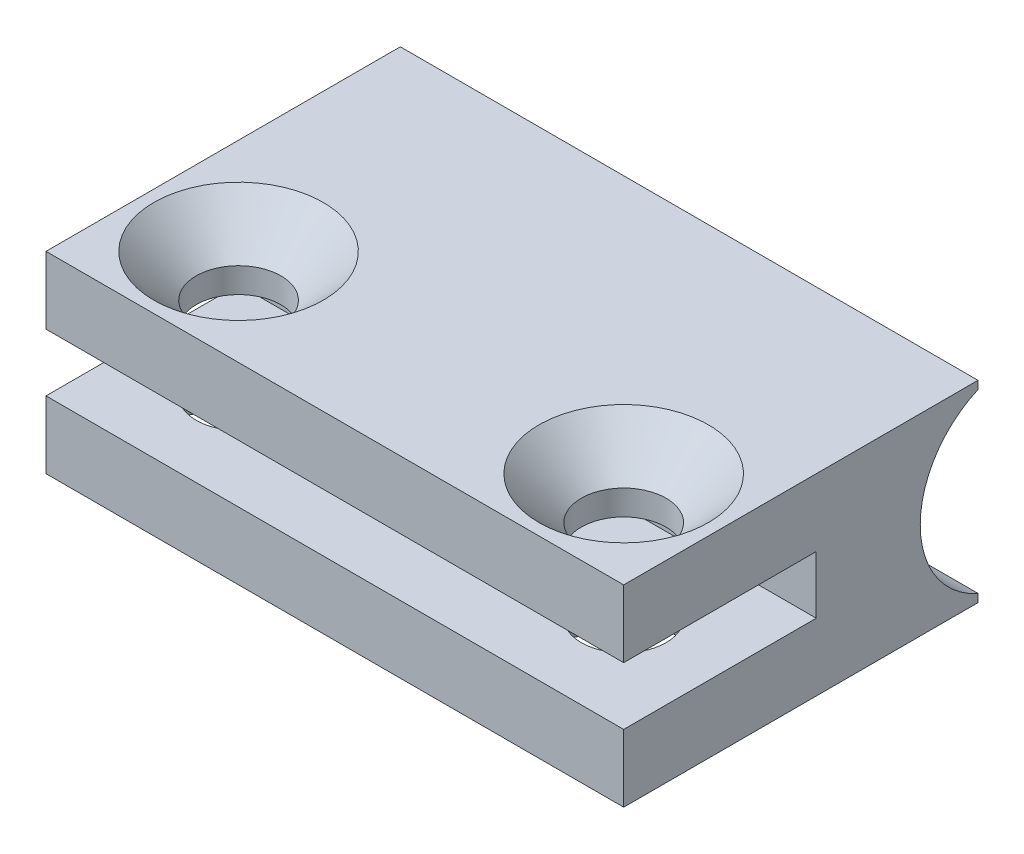
ISO-10303-21;
HEADER;
FILE_DESCRIPTION(('STEP AP214'),'2;1');
FILE_NAME('part.step','',(''),(''),'','','');
FILE_SCHEMA(('AUTOMOTIVE_DESIGN { 1 0 10303 214 1 1 1 1 }'));
ENDSEC;
DATA;
#1=APPLICATION_CONTEXT('core data for automotive mechanical design processes');
#2=APPLICATION_PROTOCOL_DEFINITION('international standard','automotive_design',2000,#1);
#3=PRODUCT_CONTEXT('',#1,'mechanical');
#4=PRODUCT('Part','Part','',(#3));
#5=PRODUCT_RELATED_PRODUCT_CATEGORY('part','',(#4));
#6=PRODUCT_DEFINITION_FORMATION('','',#4);
#7=PRODUCT_DEFINITION_CONTEXT('part definition',#1,'design');
#8=PRODUCT_DEFINITION('design','',#6,#7);
#9=PRODUCT_DEFINITION_SHAPE('','',#8);
#10=(LENGTH_UNIT() NAMED_UNIT(*) SI_UNIT(.MILLI.,.METRE.));
#11=(NAMED_UNIT(*) PLANE_ANGLE_UNIT() SI_UNIT($,.RADIAN.));
#12=(NAMED_UNIT(*) SI_UNIT($,.STERADIAN.) SOLID_ANGLE_UNIT());
#13=UNCERTAINTY_MEASURE_WITH_UNIT(LENGTH_MEASURE(1.E-05),#10,'distance_accuracy_value','');
#14=(GEOMETRIC_REPRESENTATION_CONTEXT(3) GLOBAL_UNCERTAINTY_ASSIGNED_CONTEXT((#13)) GLOBAL_UNIT_ASSIGNED_CONTEXT((#10,
#11,#12)) REPRESENTATION_CONTEXT('',''));
#15=CARTESIAN_POINT('',(0.,0.,0.));
#16=DIRECTION('',(0.,0.,1.));
#17=DIRECTION('',(1.,0.,0.));
#18=AXIS2_PLACEMENT_3D('',#15,#16,#17);
#19=CARTESIAN_POINT('',(2.5,2.5,-2.5));
#20=DIRECTION('',(0.,1.,0.));
#21=DIRECTION('',(0.,0.,1.));
#22=AXIS2_PLACEMENT_3D('',#19,#20,#21);
#23=CYLINDRICAL_SURFACE('',#22,1.1);
#24=CARTESIAN_POINT('',(2.5,-0.75,-2.5));
#25=DIRECTION('',(0.,-1.,0.));
#26=DIRECTION('',(0.,0.,-1.));
#27=AXIS2_PLACEMENT_3D('',#24,#25,#26);
#28=CIRCLE('',#27,1.1);
#29=CARTESIAN_POINT('',(2.5,-0.75,-3.6));
#30=VERTEX_POINT('',#29);
#31=EDGE_CURVE('E308',#30,#30,#28,.T.);
#32=ORIENTED_EDGE('',*,*,#31,.F.);
#33=EDGE_LOOP('',(#32));
#34=FACE_BOUND('',#33,.T.);
#35=CARTESIAN_POINT('',(2.5,-1.3,-2.5));
#36=DIRECTION('',(0.,-1.,0.));
#37=DIRECTION('',(0.,0.,-1.));
#38=AXIS2_PLACEMENT_3D('',#35,#36,#37);
#39=CIRCLE('',#38,1.1);
#40=CARTESIAN_POINT('',(2.5,-1.3,-3.6));
#41=VERTEX_POINT('',#40);
#42=EDGE_CURVE('E280',#41,#41,#39,.F.);
#43=ORIENTED_EDGE('',*,*,#42,.F.);
#44=EDGE_LOOP('',(#43));
#45=FACE_BOUND('',#44,.T.);
#46=ADVANCED_FACE('F37',(#34,#45),#23,.F.);
#47=CARTESIAN_POINT('',(15.,0.,-10.2));
#48=DIRECTION('',(-1.,0.,0.));
#49=DIRECTION('',(0.,0.,1.));
#50=AXIS2_PLACEMENT_3D('',#47,#48,#49);
#51=CYLINDRICAL_SURFACE('',#50,2.5);
#52=DIRECTION('',(-1.,0.,0.));
#53=VECTOR('',#52,1.);
#54=CARTESIAN_POINT('',(15.,-2.29128784747792,-9.2));
#55=LINE('',#54,#53);
#56=CARTESIAN_POINT('',(0.,-2.29128784747792,-9.2));
#57=VERTEX_POINT('',#56);
#58=CARTESIAN_POINT('',(15.,-2.29128784747792,-9.2));
#59=VERTEX_POINT('',#58);
#60=EDGE_CURVE('E317',#57,#59,#55,.F.);
#61=ORIENTED_EDGE('',*,*,#60,.F.);
#62=CARTESIAN_POINT('',(0.,0.,-10.2));
#63=DIRECTION('',(1.,0.,0.));
#64=DIRECTION('',(0.,0.,-1.));
#65=AXIS2_PLACEMENT_3D('',#62,#63,#64);
#66=CIRCLE('',#65,2.5);
#67=CARTESIAN_POINT('',(0.,2.29128784747792,-9.2));
#68=VERTEX_POINT('',#67);
#69=EDGE_CURVE('E328',#68,#57,#66,.T.);
#70=ORIENTED_EDGE('',*,*,#69,.F.);
#71=DIRECTION('',(-1.,0.,0.));
#72=VECTOR('',#71,1.);
#73=CARTESIAN_POINT('',(15.,2.29128784747792,-9.2));
#74=LINE('',#73,#72);
#75=CARTESIAN_POINT('',(15.,2.29128784747792,-9.2));
#76=VERTEX_POINT('',#75);
#77=EDGE_CURVE('E326',#76,#68,#74,.T.);
#78=ORIENTED_EDGE('',*,*,#77,.F.);
#79=CARTESIAN_POINT('',(15.,0.,-10.2));
#80=DIRECTION('',(1.,0.,0.));
#81=DIRECTION('',(0.,0.,-1.));
#82=AXIS2_PLACEMENT_3D('',#79,#80,#81);
#83=CIRCLE('',#82,2.5);
#84=EDGE_CURVE('E329',#76,#59,#83,.T.);
#85=ORIENTED_EDGE('',*,*,#84,.T.);
#86=EDGE_LOOP('',(#61,#70,#78,#85));
#87=FACE_BOUND('',#86,.T.);
#88=ADVANCED_FACE('F39',(#87),#51,.F.);
#89=CARTESIAN_POINT('',(15.,2.5,0.));
#90=DIRECTION('',(0.,1.,0.));
#91=DIRECTION('',(0.,0.,1.));
#92=AXIS2_PLACEMENT_3D('',#89,#90,#91);
#93=PLANE('',#92);
#94=CARTESIAN_POINT('',(12.5,2.5,-2.5));
#95=DIRECTION('',(0.,1.,0.));
#96=DIRECTION('',(0.,0.,1.));
#97=AXIS2_PLACEMENT_3D('',#94,#95,#96);
#98=CIRCLE('',#97,2.2);
#99=CARTESIAN_POINT('',(12.5,2.5,-0.299999999999999));
#100=VERTEX_POINT('',#99);
#101=EDGE_CURVE('E290',#100,#100,#98,.T.);
#102=ORIENTED_EDGE('',*,*,#101,.F.);
#103=EDGE_LOOP('',(#102));
#104=FACE_BOUND('',#103,.T.);
#105=CARTESIAN_POINT('',(2.5,2.5,-2.5));
#106=DIRECTION('',(0.,1.,0.));
#107=DIRECTION('',(0.,0.,1.));
#108=AXIS2_PLACEMENT_3D('',#105,#106,#107);
#109=CIRCLE('',#108,2.2);
#110=CARTESIAN_POINT('',(2.5,2.5,-0.299999999999999));
#111=VERTEX_POINT('',#110);
#112=EDGE_CURVE('E302',#111,#111,#109,.T.);
#113=ORIENTED_EDGE('',*,*,#112,.F.);
#114=EDGE_LOOP('',(#113));
#115=FACE_BOUND('',#114,.T.);
#116=DIRECTION('',(1.,0.,0.));
#117=VECTOR('',#116,1.);
#118=CARTESIAN_POINT('',(0.,2.5,-9.2));
#119=LINE('',#118,#117);
#120=CARTESIAN_POINT('',(0.,2.5,-9.2));
#121=VERTEX_POINT('',#120);
#122=CARTESIAN_POINT('',(15.,2.5,-9.2));
#123=VERTEX_POINT('',#122);
#124=EDGE_CURVE('E323',#121,#123,#119,.T.);
#125=ORIENTED_EDGE('',*,*,#124,.F.);
#126=DIRECTION('',(0.,0.,-1.));
#127=VECTOR('',#126,1.);
#128=CARTESIAN_POINT('',(0.,2.5,0.));
#129=LINE('',#128,#127);
#130=CARTESIAN_POINT('',(0.,2.5,0.));
#131=VERTEX_POINT('',#130);
#132=EDGE_CURVE('E352',#131,#121,#129,.T.);
#133=ORIENTED_EDGE('',*,*,#132,.F.);
#134=DIRECTION('',(-1.,0.,0.));
#135=VECTOR('',#134,1.);
#136=CARTESIAN_POINT('',(15.,2.5,0.));
#137=LINE('',#136,#135);
#138=CARTESIAN_POINT('',(15.,2.5,0.));
#139=VERTEX_POINT('',#138);
#140=EDGE_CURVE('E46',#139,#131,#137,.T.);
#141=ORIENTED_EDGE('',*,*,#140,.F.);
#142=DIRECTION('',(0.,0.,-1.));
#143=VECTOR('',#142,1.);
#144=CARTESIAN_POINT('',(15.,2.5,0.));
#145=LINE('',#144,#143);
#146=EDGE_CURVE('E332',#139,#123,#145,.T.);
#147=ORIENTED_EDGE('',*,*,#146,.T.);
#148=EDGE_LOOP('',(#125,#133,#141,#147));
#149=FACE_BOUND('',#148,.T.);
#150=ADVANCED_FACE('F395',(#104,#115,#149),#93,.T.);
#151=CARTESIAN_POINT('',(15.,0.,0.));
#152=DIRECTION('',(0.,0.,-1.));
#153=DIRECTION('',(0.,1.,0.));
#154=AXIS2_PLACEMENT_3D('',#151,#152,#153);
#155=PLANE('',#154);
#156=DIRECTION('',(0.,-1.,0.));
#157=VECTOR('',#156,1.);
#158=CARTESIAN_POINT('',(0.,0.,0.));
#159=LINE('',#158,#157);
#160=CARTESIAN_POINT('',(0.,0.75,0.));
#161=VERTEX_POINT('',#160);
#162=EDGE_CURVE('E355',#131,#161,#159,.T.);
#163=ORIENTED_EDGE('',*,*,#162,.T.);
#164=DIRECTION('',(-1.,0.,0.));
#165=VECTOR('',#164,1.);
#166=CARTESIAN_POINT('',(15.,0.75,0.));
#167=LINE('',#166,#165);
#168=CARTESIAN_POINT('',(15.,0.75,0.));
#169=VERTEX_POINT('',#168);
#170=EDGE_CURVE('E378',#169,#161,#167,.T.);
#171=ORIENTED_EDGE('',*,*,#170,.F.);
#172=DIRECTION('',(0.,-1.,0.));
#173=VECTOR('',#172,1.);
#174=CARTESIAN_POINT('',(15.,0.,0.));
#175=LINE('',#174,#173);
#176=EDGE_CURVE('E336',#139,#169,#175,.T.);
#177=ORIENTED_EDGE('',*,*,#176,.F.);
#178=ORIENTED_EDGE('',*,*,#140,.T.);
#179=EDGE_LOOP('',(#163,#171,#177,#178));
#180=FACE_BOUND('',#179,.T.);
#181=ADVANCED_FACE('F420',(#180),#155,.F.);
#182=CARTESIAN_POINT('',(15.,0.75,0.));
#183=DIRECTION('',(0.,1.,0.));
#184=DIRECTION('',(0.,0.,1.));
#185=AXIS2_PLACEMENT_3D('',#182,#183,#184);
#186=PLANE('',#185);
#187=CARTESIAN_POINT('',(12.5,0.75,-2.5));
#188=DIRECTION('',(0.,1.,0.));
#189=DIRECTION('',(0.,0.,1.));
#190=AXIS2_PLACEMENT_3D('',#187,#188,#189);
#191=CIRCLE('',#190,1.1);
#192=CARTESIAN_POINT('',(12.5,0.75,-1.4));
#193=VERTEX_POINT('',#192);
#194=EDGE_CURVE('E299',#193,#193,#191,.T.);
#195=ORIENTED_EDGE('',*,*,#194,.T.);
#196=EDGE_LOOP('',(#195));
#197=FACE_BOUND('',#196,.T.);
#198=CARTESIAN_POINT('',(2.5,0.75,-2.5));
#199=DIRECTION('',(0.,1.,0.));
#200=DIRECTION('',(0.,0.,1.));
#201=AXIS2_PLACEMENT_3D('',#198,#199,#200);
#202=CIRCLE('',#201,1.1);
#203=CARTESIAN_POINT('',(2.5,0.75,-1.4));
#204=VERTEX_POINT('',#203);
#205=EDGE_CURVE('E309',#204,#204,#202,.T.);
#206=ORIENTED_EDGE('',*,*,#205,.T.);
#207=EDGE_LOOP('',(#206));
#208=FACE_BOUND('',#207,.T.);
#209=DIRECTION('',(0.,0.,-1.));
#210=VECTOR('',#209,1.);
#211=CARTESIAN_POINT('',(0.,0.75,0.));
#212=LINE('',#211,#210);
#213=CARTESIAN_POINT('',(0.,0.75,-5.));
#214=VERTEX_POINT('',#213);
#215=EDGE_CURVE('E357',#161,#214,#212,.T.);
#216=ORIENTED_EDGE('',*,*,#215,.T.);
#217=DIRECTION('',(-1.,0.,0.));
#218=VECTOR('',#217,1.);
#219=CARTESIAN_POINT('',(15.,0.75,-5.));
#220=LINE('',#219,#218);
#221=CARTESIAN_POINT('',(15.,0.75,-5.));
#222=VERTEX_POINT('',#221);
#223=EDGE_CURVE('E375',#222,#214,#220,.T.);
#224=ORIENTED_EDGE('',*,*,#223,.F.);
#225=DIRECTION('',(0.,0.,-1.));
#226=VECTOR('',#225,1.);
#227=CARTESIAN_POINT('',(15.,0.75,0.));
#228=LINE('',#227,#226);
#229=EDGE_CURVE('E338',#169,#222,#228,.T.);
#230=ORIENTED_EDGE('',*,*,#229,.F.);
#231=ORIENTED_EDGE('',*,*,#170,.T.);
#232=EDGE_LOOP('',(#216,#224,#230,#231));
#233=FACE_BOUND('',#232,.T.);
#234=ADVANCED_FACE('F416',(#197,#208,#233),#186,.F.);
#235=CARTESIAN_POINT('',(15.,0.,-5.));
#236=DIRECTION('',(0.,0.,-1.));
#237=DIRECTION('',(-1.,0.,0.));
#238=AXIS2_PLACEMENT_3D('',#235,#236,#237);
#239=PLANE('',#238);
#240=DIRECTION('',(0.,-1.,0.));
#241=VECTOR('',#240,1.);
#242=CARTESIAN_POINT('',(0.,0.,-5.));
#243=LINE('',#242,#241);
#244=CARTESIAN_POINT('',(0.,-0.749999999999999,-5.));
#245=VERTEX_POINT('',#244);
#246=EDGE_CURVE('E359',#214,#245,#243,.T.);
#247=ORIENTED_EDGE('',*,*,#246,.T.);
#248=DIRECTION('',(-1.,0.,0.));
#249=VECTOR('',#248,1.);
#250=CARTESIAN_POINT('',(15.,-0.749999999999999,-5.));
#251=LINE('',#250,#249);
#252=CARTESIAN_POINT('',(15.,-0.749999999999999,-5.));
#253=VERTEX_POINT('',#252);
#254=EDGE_CURVE('E372',#253,#245,#251,.T.);
#255=ORIENTED_EDGE('',*,*,#254,.F.);
#256=DIRECTION('',(0.,-1.,0.));
#257=VECTOR('',#256,1.);
#258=CARTESIAN_POINT('',(15.,0.,-5.));
#259=LINE('',#258,#257);
#260=EDGE_CURVE('E340',#222,#253,#259,.T.);
#261=ORIENTED_EDGE('',*,*,#260,.F.);
#262=ORIENTED_EDGE('',*,*,#223,.T.);
#263=EDGE_LOOP('',(#247,#255,#261,#262));
#264=FACE_BOUND('',#263,.T.);
#265=ADVANCED_FACE('F419',(#264),#239,.F.);
#266=CARTESIAN_POINT('',(15.,-0.75,0.));
#267=DIRECTION('',(0.,-1.,0.));
#268=DIRECTION('',(0.,0.,-1.));
#269=AXIS2_PLACEMENT_3D('',#266,#267,#268);
#270=PLANE('',#269);
#271=CARTESIAN_POINT('',(12.5,-0.75,-2.5));
#272=DIRECTION('',(0.,-1.,0.));
#273=DIRECTION('',(0.,0.,-1.));
#274=AXIS2_PLACEMENT_3D('',#271,#272,#273);
#275=CIRCLE('',#274,1.1);
#276=CARTESIAN_POINT('',(12.5,-0.75,-3.6));
#277=VERTEX_POINT('',#276);
#278=EDGE_CURVE('E296',#277,#277,#275,.T.);
#279=ORIENTED_EDGE('',*,*,#278,.T.);
#280=EDGE_LOOP('',(#279));
#281=FACE_BOUND('',#280,.T.);
#282=ORIENTED_EDGE('',*,*,#31,.T.);
#283=EDGE_LOOP('',(#282));
#284=FACE_BOUND('',#283,.T.);
#285=DIRECTION('',(0.,0.,1.));
#286=VECTOR('',#285,1.);
#287=CARTESIAN_POINT('',(0.,-0.75,0.));
#288=LINE('',#287,#286);
#289=CARTESIAN_POINT('',(0.,-0.75,0.));
#290=VERTEX_POINT('',#289);
#291=EDGE_CURVE('E361',#245,#290,#288,.T.);
#292=ORIENTED_EDGE('',*,*,#291,.T.);
#293=DIRECTION('',(-1.,0.,0.));
#294=VECTOR('',#293,1.);
#295=CARTESIAN_POINT('',(15.,-0.75,0.));
#296=LINE('',#295,#294);
#297=CARTESIAN_POINT('',(15.,-0.75,0.));
#298=VERTEX_POINT('',#297);
#299=EDGE_CURVE('E369',#298,#290,#296,.T.);
#300=ORIENTED_EDGE('',*,*,#299,.F.);
#301=DIRECTION('',(0.,0.,1.));
#302=VECTOR('',#301,1.);
#303=CARTESIAN_POINT('',(15.,-0.75,0.));
#304=LINE('',#303,#302);
#305=EDGE_CURVE('E342',#253,#298,#304,.T.);
#306=ORIENTED_EDGE('',*,*,#305,.F.);
#307=ORIENTED_EDGE('',*,*,#254,.T.);
#308=EDGE_LOOP('',(#292,#300,#306,#307));
#309=FACE_BOUND('',#308,.T.);
#310=ADVANCED_FACE('F439',(#281,#284,#309),#270,.F.);
#311=CARTESIAN_POINT('',(15.,0.,0.));
#312=DIRECTION('',(0.,0.,-1.));
#313=DIRECTION('',(0.,1.,0.));
#314=AXIS2_PLACEMENT_3D('',#311,#312,#313);
#315=PLANE('',#314);
#316=DIRECTION('',(0.,-1.,0.));
#317=VECTOR('',#316,1.);
#318=CARTESIAN_POINT('',(0.,0.,0.));
#319=LINE('',#318,#317);
#320=CARTESIAN_POINT('',(0.,-2.5,0.));
#321=VERTEX_POINT('',#320);
#322=EDGE_CURVE('E363',#290,#321,#319,.T.);
#323=ORIENTED_EDGE('',*,*,#322,.T.);
#324=DIRECTION('',(-1.,0.,0.));
#325=VECTOR('',#324,1.);
#326=CARTESIAN_POINT('',(15.,-2.5,0.));
#327=LINE('',#326,#325);
#328=CARTESIAN_POINT('',(15.,-2.5,0.));
#329=VERTEX_POINT('',#328);
#330=EDGE_CURVE('E349',#329,#321,#327,.T.);
#331=ORIENTED_EDGE('',*,*,#330,.F.);
#332=DIRECTION('',(0.,-1.,0.));
#333=VECTOR('',#332,1.);
#334=CARTESIAN_POINT('',(15.,0.,0.));
#335=LINE('',#334,#333);
#336=EDGE_CURVE('E344',#298,#329,#335,.T.);
#337=ORIENTED_EDGE('',*,*,#336,.F.);
#338=ORIENTED_EDGE('',*,*,#299,.T.);
#339=EDGE_LOOP('',(#323,#331,#337,#338));
#340=FACE_BOUND('',#339,.T.);
#341=ADVANCED_FACE('F443',(#340),#315,.F.);
#342=CARTESIAN_POINT('',(15.,-2.5,0.));
#343=DIRECTION('',(0.,1.,0.));
#344=DIRECTION('',(0.,0.,1.));
#345=AXIS2_PLACEMENT_3D('',#342,#343,#344);
#346=PLANE('',#345);
#347=DIRECTION('',(-0.499999848576382,0.,0.866025491208887));
#348=VECTOR('',#347,1.);
#349=CARTESIAN_POINT('',(13.6788678706118,-2.5,-0.458141777184819));
#350=LINE('',#349,#348);
#351=CARTESIAN_POINT('',(14.85773502719,-2.5,-2.50000041224744));
#352=VERTEX_POINT('',#351);
#353=CARTESIAN_POINT('',(13.6788678706118,-2.5,-0.458141777184819));
#354=VERTEX_POINT('',#353);
#355=EDGE_CURVE('E224',#352,#354,#350,.T.);
#356=ORIENTED_EDGE('',*,*,#355,.F.);
#357=DIRECTION('',(0.500000151423603,0.,0.866025316359963));
#358=VECTOR('',#357,1.);
#359=CARTESIAN_POINT('',(14.85773502719,-2.5,-2.50000041224744));
#360=LINE('',#359,#358);
#361=CARTESIAN_POINT('',(13.6788671565783,-2.5,-4.54185863506263));
#362=VERTEX_POINT('',#361);
#363=EDGE_CURVE('E54',#362,#352,#360,.T.);
#364=ORIENTED_EDGE('',*,*,#363,.F.);
#365=DIRECTION('',(0.999999999999985,0.,-1.7484892464676E-07));
#366=VECTOR('',#365,1.);
#367=CARTESIAN_POINT('',(13.6788671565783,-2.5,-4.54185863506263));
#368=LINE('',#367,#366);
#369=CARTESIAN_POINT('',(11.3211321293883,-2.5,-4.5418582228152));
#370=VERTEX_POINT('',#369);
#371=EDGE_CURVE('E210',#370,#362,#368,.T.);
#372=ORIENTED_EDGE('',*,*,#371,.F.);
#373=DIRECTION('',(0.499999848576382,0.,-0.866025491208888));
#374=VECTOR('',#373,1.);
#375=CARTESIAN_POINT('',(11.3211321293883,-2.5,-4.5418582228152));
#376=LINE('',#375,#374);
#377=CARTESIAN_POINT('',(10.1422649728101,-2.5,-2.49999958775258));
#378=VERTEX_POINT('',#377);
#379=EDGE_CURVE('E213',#378,#370,#376,.T.);
#380=ORIENTED_EDGE('',*,*,#379,.F.);
#381=DIRECTION('',(-0.500000151423603,0.,-0.866025316359963));
#382=VECTOR('',#381,1.);
#383=CARTESIAN_POINT('',(10.1422649728101,-2.5,-2.49999958775258));
#384=LINE('',#383,#382);
#385=CARTESIAN_POINT('',(11.3211328434218,-2.5,-0.458141364937385));
#386=VERTEX_POINT('',#385);
#387=EDGE_CURVE('E229',#386,#378,#384,.T.);
#388=ORIENTED_EDGE('',*,*,#387,.F.);
#389=DIRECTION('',(-0.999999999999985,0.,1.74848924715738E-07));
#390=VECTOR('',#389,1.);
#391=CARTESIAN_POINT('',(11.3211328434218,-2.5,-0.458141364937385));
#392=LINE('',#391,#390);
#393=EDGE_CURVE('E226',#354,#386,#392,.T.);
#394=ORIENTED_EDGE('',*,*,#393,.F.);
#395=EDGE_LOOP('',(#356,#364,#372,#380,#388,#394));
#396=FACE_BOUND('',#395,.T.);
#397=DIRECTION('',(-0.499999848576382,0.,-0.866025491208888));
#398=VECTOR('',#397,1.);
#399=CARTESIAN_POINT('',(1.3211321293882,-2.5,-0.458141777184819));
#400=LINE('',#399,#398);
#401=CARTESIAN_POINT('',(1.3211321293882,-2.5,-0.458141777184819));
#402=VERTEX_POINT('',#401);
#403=CARTESIAN_POINT('',(0.142264972809967,-2.5,-2.50000041224744));
#404=VERTEX_POINT('',#403);
#405=EDGE_CURVE('E264',#402,#404,#400,.T.);
#406=ORIENTED_EDGE('',*,*,#405,.F.);
#407=DIRECTION('',(-0.999999999999985,0.,-1.74848924715738E-07));
#408=VECTOR('',#407,1.);
#409=CARTESIAN_POINT('',(3.67886715657817,-2.5,-0.458141364937385));
#410=LINE('',#409,#408);
#411=CARTESIAN_POINT('',(3.67886715657817,-2.5,-0.458141364937385));
#412=VERTEX_POINT('',#411);
#413=EDGE_CURVE('E62',#412,#402,#410,.T.);
#414=ORIENTED_EDGE('',*,*,#413,.F.);
#415=DIRECTION('',(-0.500000151423603,0.,0.866025316359963));
#416=VECTOR('',#415,1.);
#417=CARTESIAN_POINT('',(4.8577350271899,-2.5,-2.49999958775258));
#418=LINE('',#417,#416);
#419=CARTESIAN_POINT('',(4.8577350271899,-2.5,-2.49999958775258));
#420=VERTEX_POINT('',#419);
#421=EDGE_CURVE('E247',#420,#412,#418,.T.);
#422=ORIENTED_EDGE('',*,*,#421,.F.);
#423=DIRECTION('',(0.499999848576382,0.,0.866025491208888));
#424=VECTOR('',#423,1.);
#425=CARTESIAN_POINT('',(3.67886787061167,-2.5,-4.5418582228152));
#426=LINE('',#425,#424);
#427=CARTESIAN_POINT('',(3.67886787061167,-2.5,-4.5418582228152));
#428=VERTEX_POINT('',#427);
#429=EDGE_CURVE('E273',#428,#420,#426,.T.);
#430=ORIENTED_EDGE('',*,*,#429,.F.);
#431=DIRECTION('',(0.999999999999985,0.,1.7484892464676E-07));
#432=VECTOR('',#431,1.);
#433=CARTESIAN_POINT('',(1.3211328434217,-2.5,-4.54185863506263));
#434=LINE('',#433,#432);
#435=CARTESIAN_POINT('',(1.3211328434217,-2.5,-4.54185863506263));
#436=VERTEX_POINT('',#435);
#437=EDGE_CURVE('E270',#436,#428,#434,.T.);
#438=ORIENTED_EDGE('',*,*,#437,.F.);
#439=DIRECTION('',(0.500000151423603,0.,-0.866025316359963));
#440=VECTOR('',#439,1.);
#441=CARTESIAN_POINT('',(0.142264972809967,-2.5,-2.50000041224744));
#442=LINE('',#441,#440);
#443=EDGE_CURVE('E267',#404,#436,#442,.T.);
#444=ORIENTED_EDGE('',*,*,#443,.F.);
#445=EDGE_LOOP('',(#406,#414,#422,#430,#438,#444));
#446=FACE_BOUND('',#445,.T.);
#447=DIRECTION('',(0.,0.,-1.));
#448=VECTOR('',#447,1.);
#449=CARTESIAN_POINT('',(0.,-2.5,0.));
#450=LINE('',#449,#448);
#451=CARTESIAN_POINT('',(0.,-2.5,-9.2));
#452=VERTEX_POINT('',#451);
#453=EDGE_CURVE('E333',#321,#452,#450,.T.);
#454=ORIENTED_EDGE('',*,*,#453,.T.);
#455=DIRECTION('',(1.,0.,0.));
#456=VECTOR('',#455,1.);
#457=CARTESIAN_POINT('',(0.,-2.5,-9.2));
#458=LINE('',#457,#456);
#459=CARTESIAN_POINT('',(15.,-2.5,-9.2));
#460=VERTEX_POINT('',#459);
#461=EDGE_CURVE('E314',#452,#460,#458,.T.);
#462=ORIENTED_EDGE('',*,*,#461,.T.);
#463=DIRECTION('',(0.,0.,-1.));
#464=VECTOR('',#463,1.);
#465=CARTESIAN_POINT('',(15.,-2.5,0.));
#466=LINE('',#465,#464);
#467=EDGE_CURVE('E346',#329,#460,#466,.T.);
#468=ORIENTED_EDGE('',*,*,#467,.F.);
#469=ORIENTED_EDGE('',*,*,#330,.T.);
#470=EDGE_LOOP('',(#454,#462,#468,#469));
#471=FACE_BOUND('',#470,.T.);
#472=ADVANCED_FACE('F462',(#396,#446,#471),#346,.F.);
#473=CARTESIAN_POINT('',(15.,0.,0.));
#474=DIRECTION('',(1.,0.,0.));
#475=DIRECTION('',(0.,0.,-1.));
#476=AXIS2_PLACEMENT_3D('',#473,#474,#475);
#477=PLANE('',#476);
#478=DIRECTION('',(0.,-1.,0.));
#479=VECTOR('',#478,1.);
#480=CARTESIAN_POINT('',(15.,-2.5,-9.2));
#481=LINE('',#480,#479);
#482=EDGE_CURVE('E312',#59,#460,#481,.T.);
#483=ORIENTED_EDGE('',*,*,#482,.F.);
#484=ORIENTED_EDGE('',*,*,#84,.F.);
#485=DIRECTION('',(0.,-1.,0.));
#486=VECTOR('',#485,1.);
#487=CARTESIAN_POINT('',(15.,2.5,-9.2));
#488=LINE('',#487,#486);
#489=EDGE_CURVE('E319',#123,#76,#488,.T.);
#490=ORIENTED_EDGE('',*,*,#489,.F.);
#491=ORIENTED_EDGE('',*,*,#146,.F.);
#492=ORIENTED_EDGE('',*,*,#176,.T.);
#493=ORIENTED_EDGE('',*,*,#229,.T.);
#494=ORIENTED_EDGE('',*,*,#260,.T.);
#495=ORIENTED_EDGE('',*,*,#305,.T.);
#496=ORIENTED_EDGE('',*,*,#336,.T.);
#497=ORIENTED_EDGE('',*,*,#467,.T.);
#498=EDGE_LOOP('',(#483,#484,#490,#491,#492,#493,#494,#495,#496,#497));
#499=FACE_BOUND('',#498,.T.);
#500=ADVANCED_FACE('F448',(#499),#477,.T.);
#501=CARTESIAN_POINT('',(0.,0.,0.));
#502=DIRECTION('',(1.,0.,0.));
#503=DIRECTION('',(0.,0.,-1.));
#504=AXIS2_PLACEMENT_3D('',#501,#502,#503);
#505=PLANE('',#504);
#506=ORIENTED_EDGE('',*,*,#69,.T.);
#507=DIRECTION('',(0.,-1.,0.));
#508=VECTOR('',#507,1.);
#509=CARTESIAN_POINT('',(0.,0.,-9.2));
#510=LINE('',#509,#508);
#511=EDGE_CURVE('E11',#57,#452,#510,.T.);
#512=ORIENTED_EDGE('',*,*,#511,.T.);
#513=ORIENTED_EDGE('',*,*,#453,.F.);
#514=ORIENTED_EDGE('',*,*,#322,.F.);
#515=ORIENTED_EDGE('',*,*,#291,.F.);
#516=ORIENTED_EDGE('',*,*,#246,.F.);
#517=ORIENTED_EDGE('',*,*,#215,.F.);
#518=ORIENTED_EDGE('',*,*,#162,.F.);
#519=ORIENTED_EDGE('',*,*,#132,.T.);
#520=DIRECTION('',(0.,-1.,0.));
#521=VECTOR('',#520,1.);
#522=CARTESIAN_POINT('',(0.,2.5,-9.2));
#523=LINE('',#522,#521);
#524=EDGE_CURVE('E320',#121,#68,#523,.T.);
#525=ORIENTED_EDGE('',*,*,#524,.T.);
#526=EDGE_LOOP('',(#506,#512,#513,#514,#515,#516,#517,#518,#519,#525));
#527=FACE_BOUND('',#526,.T.);
#528=ADVANCED_FACE('F434',(#527),#505,.F.);
#529=CARTESIAN_POINT('',(0.,2.5,-9.2));
#530=DIRECTION('',(0.,0.,1.));
#531=DIRECTION('',(1.,0.,0.));
#532=AXIS2_PLACEMENT_3D('',#529,#530,#531);
#533=PLANE('',#532);
#534=ORIENTED_EDGE('',*,*,#77,.T.);
#535=ORIENTED_EDGE('',*,*,#524,.F.);
#536=ORIENTED_EDGE('',*,*,#124,.T.);
#537=ORIENTED_EDGE('',*,*,#489,.T.);
#538=EDGE_LOOP('',(#534,#535,#536,#537));
#539=FACE_BOUND('',#538,.T.);
#540=ADVANCED_FACE('F410',(#539),#533,.F.);
#541=CARTESIAN_POINT('',(0.,-2.5,-9.2));
#542=DIRECTION('',(0.,0.,1.));
#543=DIRECTION('',(1.,0.,0.));
#544=AXIS2_PLACEMENT_3D('',#541,#542,#543);
#545=PLANE('',#544);
#546=ORIENTED_EDGE('',*,*,#60,.T.);
#547=ORIENTED_EDGE('',*,*,#482,.T.);
#548=ORIENTED_EDGE('',*,*,#461,.F.);
#549=ORIENTED_EDGE('',*,*,#511,.F.);
#550=EDGE_LOOP('',(#546,#547,#548,#549));
#551=FACE_BOUND('',#550,.T.);
#552=ADVANCED_FACE('F402',(#551),#545,.F.);
#553=CARTESIAN_POINT('',(2.5,1.4,-2.5));
#554=DIRECTION('',(0.,1.,0.));
#555=DIRECTION('',(0.,0.,1.));
#556=AXIS2_PLACEMENT_3D('',#553,#554,#555);
#557=CIRCLE('',#556,1.1);
#558=CARTESIAN_POINT('',(2.5,1.4,-1.4));
#559=VERTEX_POINT('',#558);
#560=EDGE_CURVE('E305',#559,#559,#557,.T.);
#561=ORIENTED_EDGE('',*,*,#560,.T.);
#562=EDGE_LOOP('',(#561));
#563=FACE_BOUND('',#562,.T.);
#564=ORIENTED_EDGE('',*,*,#205,.F.);
#565=EDGE_LOOP('',(#564));
#566=FACE_BOUND('',#565,.T.);
#567=ADVANCED_FACE('F391',(#563,#566),#23,.F.);
#568=CARTESIAN_POINT('',(2.5,2.5,-2.5));
#569=DIRECTION('',(0.,1.,0.));
#570=DIRECTION('',(0.,0.,1.));
#571=AXIS2_PLACEMENT_3D('',#568,#569,#570);
#572=CONICAL_SURFACE('',#571,2.2,0.785398163397449);
#573=ORIENTED_EDGE('',*,*,#560,.F.);
#574=EDGE_LOOP('',(#573));
#575=FACE_BOUND('',#574,.T.);
#576=ORIENTED_EDGE('',*,*,#112,.T.);
#577=EDGE_LOOP('',(#576));
#578=FACE_BOUND('',#577,.T.);
#579=ADVANCED_FACE('F401',(#575,#578),#572,.F.);
#580=CARTESIAN_POINT('',(12.5,2.5,-2.5));
#581=DIRECTION('',(0.,1.,0.));
#582=DIRECTION('',(0.,0.,1.));
#583=AXIS2_PLACEMENT_3D('',#580,#581,#582);
#584=CYLINDRICAL_SURFACE('',#583,1.1);
#585=CARTESIAN_POINT('',(12.5,-1.3,-2.5));
#586=DIRECTION('',(0.,1.,0.));
#587=DIRECTION('',(0.,0.,1.));
#588=AXIS2_PLACEMENT_3D('',#585,#586,#587);
#589=CIRCLE('',#588,1.1);
#590=CARTESIAN_POINT('',(12.5,-1.3,-1.4));
#591=VERTEX_POINT('',#590);
#592=EDGE_CURVE('E41',#591,#591,#589,.F.);
#593=ORIENTED_EDGE('',*,*,#592,.T.);
#594=EDGE_LOOP('',(#593));
#595=FACE_BOUND('',#594,.T.);
#596=ORIENTED_EDGE('',*,*,#278,.F.);
#597=EDGE_LOOP('',(#596));
#598=FACE_BOUND('',#597,.T.);
#599=ADVANCED_FACE('F408',(#595,#598),#584,.F.);
#600=CARTESIAN_POINT('',(12.5,1.4,-2.5));
#601=DIRECTION('',(0.,1.,0.));
#602=DIRECTION('',(0.,0.,1.));
#603=AXIS2_PLACEMENT_3D('',#600,#601,#602);
#604=CIRCLE('',#603,1.1);
#605=CARTESIAN_POINT('',(12.5,1.4,-1.4));
#606=VERTEX_POINT('',#605);
#607=EDGE_CURVE('E293',#606,#606,#604,.T.);
#608=ORIENTED_EDGE('',*,*,#607,.T.);
#609=EDGE_LOOP('',(#608));
#610=FACE_BOUND('',#609,.T.);
#611=ORIENTED_EDGE('',*,*,#194,.F.);
#612=EDGE_LOOP('',(#611));
#613=FACE_BOUND('',#612,.T.);
#614=ADVANCED_FACE('F492',(#610,#613),#584,.F.);
#615=CARTESIAN_POINT('',(12.5,2.5,-2.5));
#616=DIRECTION('',(0.,1.,0.));
#617=DIRECTION('',(0.,0.,1.));
#618=AXIS2_PLACEMENT_3D('',#615,#616,#617);
#619=CONICAL_SURFACE('',#618,2.2,0.785398163397449);
#620=ORIENTED_EDGE('',*,*,#607,.F.);
#621=EDGE_LOOP('',(#620));
#622=FACE_BOUND('',#621,.T.);
#623=ORIENTED_EDGE('',*,*,#101,.T.);
#624=EDGE_LOOP('',(#623));
#625=FACE_BOUND('',#624,.T.);
#626=ADVANCED_FACE('F490',(#622,#625),#619,.F.);
#627=CARTESIAN_POINT('',(0.,-1.3,0.));
#628=DIRECTION('',(0.,-1.,0.));
#629=DIRECTION('',(0.,0.,-1.));
#630=AXIS2_PLACEMENT_3D('',#627,#628,#629);
#631=PLANE('',#630);
#632=DIRECTION('',(-0.999999999999985,0.,-1.74848924715738E-07));
#633=VECTOR('',#632,1.);
#634=CARTESIAN_POINT('',(3.67886715657817,-1.3,-0.458141364937385));
#635=LINE('',#634,#633);
#636=CARTESIAN_POINT('',(3.67886715657817,-1.3,-0.458141364937385));
#637=VERTEX_POINT('',#636);
#638=CARTESIAN_POINT('',(1.3211321293882,-1.3,-0.458141777184819));
#639=VERTEX_POINT('',#638);
#640=EDGE_CURVE('E243',#637,#639,#635,.T.);
#641=ORIENTED_EDGE('',*,*,#640,.T.);
#642=DIRECTION('',(-0.499999848576382,0.,-0.866025491208888));
#643=VECTOR('',#642,1.);
#644=CARTESIAN_POINT('',(1.3211321293882,-1.3,-0.458141777184819));
#645=LINE('',#644,#643);
#646=CARTESIAN_POINT('',(0.142264972809967,-1.3,-2.50000041224744));
#647=VERTEX_POINT('',#646);
#648=EDGE_CURVE('E246',#639,#647,#645,.T.);
#649=ORIENTED_EDGE('',*,*,#648,.T.);
#650=DIRECTION('',(0.500000151423603,0.,-0.866025316359963));
#651=VECTOR('',#650,1.);
#652=CARTESIAN_POINT('',(0.142264972809967,-1.3,-2.50000041224744));
#653=LINE('',#652,#651);
#654=CARTESIAN_POINT('',(1.3211328434217,-1.3,-4.54185863506263));
#655=VERTEX_POINT('',#654);
#656=EDGE_CURVE('E250',#647,#655,#653,.T.);
#657=ORIENTED_EDGE('',*,*,#656,.T.);
#658=DIRECTION('',(0.999999999999985,0.,1.7484892464676E-07));
#659=VECTOR('',#658,1.);
#660=CARTESIAN_POINT('',(1.3211328434217,-1.3,-4.54185863506263));
#661=LINE('',#660,#659);
#662=CARTESIAN_POINT('',(3.67886787061167,-1.3,-4.5418582228152));
#663=VERTEX_POINT('',#662);
#664=EDGE_CURVE('E253',#655,#663,#661,.T.);
#665=ORIENTED_EDGE('',*,*,#664,.T.);
#666=DIRECTION('',(0.499999848576382,0.,0.866025491208888));
#667=VECTOR('',#666,1.);
#668=CARTESIAN_POINT('',(3.67886787061167,-1.3,-4.5418582228152));
#669=LINE('',#668,#667);
#670=CARTESIAN_POINT('',(4.8577350271899,-1.3,-2.49999958775258));
#671=VERTEX_POINT('',#670);
#672=EDGE_CURVE('E256',#663,#671,#669,.T.);
#673=ORIENTED_EDGE('',*,*,#672,.T.);
#674=DIRECTION('',(-0.500000151423603,0.,0.866025316359963));
#675=VECTOR('',#674,1.);
#676=CARTESIAN_POINT('',(4.8577350271899,-1.3,-2.49999958775258));
#677=LINE('',#676,#675);
#678=EDGE_CURVE('E259',#671,#637,#677,.T.);
#679=ORIENTED_EDGE('',*,*,#678,.T.);
#680=EDGE_LOOP('',(#641,#649,#657,#665,#673,#679));
#681=FACE_BOUND('',#680,.T.);
#682=ORIENTED_EDGE('',*,*,#42,.T.);
#683=EDGE_LOOP('',(#682));
#684=FACE_BOUND('',#683,.T.);
#685=ADVANCED_FACE('F386',(#681,#684),#631,.T.);
#686=CARTESIAN_POINT('',(3.67886715657817,-1.3,-0.458141364937385));
#687=DIRECTION('',(-1.74848924715738E-07,0.,0.999999999999985));
#688=DIRECTION('',(0.999999999999985,0.,1.74848924715738E-07));
#689=AXIS2_PLACEMENT_3D('',#686,#687,#688);
#690=PLANE('',#689);
#691=ORIENTED_EDGE('',*,*,#413,.T.);
#692=DIRECTION('',(0.,-1.,0.));
#693=VECTOR('',#692,1.);
#694=CARTESIAN_POINT('',(1.3211321293882,-1.3,-0.458141777184819));
#695=LINE('',#694,#693);
#696=EDGE_CURVE('E262',#639,#402,#695,.T.);
#697=ORIENTED_EDGE('',*,*,#696,.F.);
#698=ORIENTED_EDGE('',*,*,#640,.F.);
#699=DIRECTION('',(0.,-1.,0.));
#700=VECTOR('',#699,1.);
#701=CARTESIAN_POINT('',(3.67886715657817,-1.3,-0.458141364937385));
#702=LINE('',#701,#700);
#703=EDGE_CURVE('E278',#637,#412,#702,.T.);
#704=ORIENTED_EDGE('',*,*,#703,.T.);
#705=EDGE_LOOP('',(#691,#697,#698,#704));
#706=FACE_BOUND('',#705,.T.);
#707=ADVANCED_FACE('F499',(#706),#690,.F.);
#708=CARTESIAN_POINT('',(4.8577350271899,-1.3,-2.49999958775258));
#709=DIRECTION('',(0.866025316359963,0.,0.500000151423603));
#710=DIRECTION('',(0.500000151423603,0.,-0.866025316359963));
#711=AXIS2_PLACEMENT_3D('',#708,#709,#710);
#712=PLANE('',#711);
#713=ORIENTED_EDGE('',*,*,#421,.T.);
#714=ORIENTED_EDGE('',*,*,#703,.F.);
#715=ORIENTED_EDGE('',*,*,#678,.F.);
#716=DIRECTION('',(0.,-1.,0.));
#717=VECTOR('',#716,1.);
#718=CARTESIAN_POINT('',(4.8577350271899,-1.3,-2.49999958775258));
#719=LINE('',#718,#717);
#720=EDGE_CURVE('E281',#671,#420,#719,.T.);
#721=ORIENTED_EDGE('',*,*,#720,.T.);
#722=EDGE_LOOP('',(#713,#714,#715,#721));
#723=FACE_BOUND('',#722,.T.);
#724=ADVANCED_FACE('F508',(#723),#712,.F.);
#725=CARTESIAN_POINT('',(3.67886787061167,-1.3,-4.5418582228152));
#726=DIRECTION('',(0.866025491208888,0.,-0.499999848576382));
#727=DIRECTION('',(-0.499999848576382,0.,-0.866025491208888));
#728=AXIS2_PLACEMENT_3D('',#725,#726,#727);
#729=PLANE('',#728);
#730=ORIENTED_EDGE('',*,*,#429,.T.);
#731=ORIENTED_EDGE('',*,*,#720,.F.);
#732=ORIENTED_EDGE('',*,*,#672,.F.);
#733=DIRECTION('',(0.,-1.,0.));
#734=VECTOR('',#733,1.);
#735=CARTESIAN_POINT('',(3.67886787061167,-1.3,-4.5418582228152));
#736=LINE('',#735,#734);
#737=EDGE_CURVE('E283',#663,#428,#736,.T.);
#738=ORIENTED_EDGE('',*,*,#737,.T.);
#739=EDGE_LOOP('',(#730,#731,#732,#738));
#740=FACE_BOUND('',#739,.T.);
#741=ADVANCED_FACE('F520',(#740),#729,.F.);
#742=CARTESIAN_POINT('',(1.3211328434217,-1.3,-4.54185863506263));
#743=DIRECTION('',(1.7484892464676E-07,0.,-0.999999999999985));
#744=DIRECTION('',(-0.999999999999985,0.,-1.7484892464676E-07));
#745=AXIS2_PLACEMENT_3D('',#742,#743,#744);
#746=PLANE('',#745);
#747=ORIENTED_EDGE('',*,*,#437,.T.);
#748=ORIENTED_EDGE('',*,*,#737,.F.);
#749=ORIENTED_EDGE('',*,*,#664,.F.);
#750=DIRECTION('',(0.,-1.,0.));
#751=VECTOR('',#750,1.);
#752=CARTESIAN_POINT('',(1.3211328434217,-1.3,-4.54185863506263));
#753=LINE('',#752,#751);
#754=EDGE_CURVE('E285',#655,#436,#753,.T.);
#755=ORIENTED_EDGE('',*,*,#754,.T.);
#756=EDGE_LOOP('',(#747,#748,#749,#755));
#757=FACE_BOUND('',#756,.T.);
#758=ADVANCED_FACE('F516',(#757),#746,.F.);
#759=CARTESIAN_POINT('',(0.142264972809967,-1.3,-2.50000041224744));
#760=DIRECTION('',(-0.866025316359963,0.,-0.500000151423603));
#761=DIRECTION('',(-0.500000151423603,0.,0.866025316359963));
#762=AXIS2_PLACEMENT_3D('',#759,#760,#761);
#763=PLANE('',#762);
#764=ORIENTED_EDGE('',*,*,#443,.T.);
#765=ORIENTED_EDGE('',*,*,#754,.F.);
#766=ORIENTED_EDGE('',*,*,#656,.F.);
#767=DIRECTION('',(0.,-1.,0.));
#768=VECTOR('',#767,1.);
#769=CARTESIAN_POINT('',(0.142264972809967,-1.3,-2.50000041224744));
#770=LINE('',#769,#768);
#771=EDGE_CURVE('E287',#647,#404,#770,.T.);
#772=ORIENTED_EDGE('',*,*,#771,.T.);
#773=EDGE_LOOP('',(#764,#765,#766,#772));
#774=FACE_BOUND('',#773,.T.);
#775=ADVANCED_FACE('F512',(#774),#763,.F.);
#776=CARTESIAN_POINT('',(1.3211321293882,-1.3,-0.458141777184819));
#777=DIRECTION('',(-0.866025491208888,0.,0.499999848576382));
#778=DIRECTION('',(0.499999848576382,0.,0.866025491208888));
#779=AXIS2_PLACEMENT_3D('',#776,#777,#778);
#780=PLANE('',#779);
#781=ORIENTED_EDGE('',*,*,#405,.T.);
#782=ORIENTED_EDGE('',*,*,#771,.F.);
#783=ORIENTED_EDGE('',*,*,#648,.F.);
#784=ORIENTED_EDGE('',*,*,#696,.T.);
#785=EDGE_LOOP('',(#781,#782,#783,#784));
#786=FACE_BOUND('',#785,.T.);
#787=ADVANCED_FACE('F509',(#786),#780,.F.);
#788=CARTESIAN_POINT('',(0.,-1.3,0.));
#789=DIRECTION('',(0.,1.,0.));
#790=DIRECTION('',(0.,0.,1.));
#791=AXIS2_PLACEMENT_3D('',#788,#789,#790);
#792=PLANE('',#791);
#793=DIRECTION('',(0.500000151423603,0.,0.866025316359963));
#794=VECTOR('',#793,1.);
#795=CARTESIAN_POINT('',(14.85773502719,-1.3,-2.50000041224744));
#796=LINE('',#795,#794);
#797=CARTESIAN_POINT('',(13.6788671565783,-1.3,-4.54185863506263));
#798=VERTEX_POINT('',#797);
#799=CARTESIAN_POINT('',(14.85773502719,-1.3,-2.50000041224744));
#800=VERTEX_POINT('',#799);
#801=EDGE_CURVE('E190',#798,#800,#796,.T.);
#802=ORIENTED_EDGE('',*,*,#801,.T.);
#803=DIRECTION('',(-0.499999848576382,0.,0.866025491208887));
#804=VECTOR('',#803,1.);
#805=CARTESIAN_POINT('',(13.6788678706118,-1.3,-0.458141777184819));
#806=LINE('',#805,#804);
#807=CARTESIAN_POINT('',(13.6788678706118,-1.3,-0.458141777184819));
#808=VERTEX_POINT('',#807);
#809=EDGE_CURVE('E199',#800,#808,#806,.T.);
#810=ORIENTED_EDGE('',*,*,#809,.T.);
#811=DIRECTION('',(-0.999999999999985,0.,1.74848924715738E-07));
#812=VECTOR('',#811,1.);
#813=CARTESIAN_POINT('',(11.3211328434218,-1.3,-0.458141364937385));
#814=LINE('',#813,#812);
#815=CARTESIAN_POINT('',(11.3211328434218,-1.3,-0.458141364937385));
#816=VERTEX_POINT('',#815);
#817=EDGE_CURVE('E204',#808,#816,#814,.T.);
#818=ORIENTED_EDGE('',*,*,#817,.T.);
#819=DIRECTION('',(-0.500000151423603,0.,-0.866025316359963));
#820=VECTOR('',#819,1.);
#821=CARTESIAN_POINT('',(10.1422649728101,-1.3,-2.49999958775258));
#822=LINE('',#821,#820);
#823=CARTESIAN_POINT('',(10.1422649728101,-1.3,-2.49999958775258));
#824=VERTEX_POINT('',#823);
#825=EDGE_CURVE('E217',#816,#824,#822,.T.);
#826=ORIENTED_EDGE('',*,*,#825,.T.);
#827=DIRECTION('',(0.499999848576382,0.,-0.866025491208888));
#828=VECTOR('',#827,1.);
#829=CARTESIAN_POINT('',(11.3211321293883,-1.3,-4.5418582228152));
#830=LINE('',#829,#828);
#831=CARTESIAN_POINT('',(11.3211321293883,-1.3,-4.5418582228152));
#832=VERTEX_POINT('',#831);
#833=EDGE_CURVE('E220',#824,#832,#830,.T.);
#834=ORIENTED_EDGE('',*,*,#833,.T.);
#835=DIRECTION('',(0.999999999999985,0.,-1.7484892464676E-07));
#836=VECTOR('',#835,1.);
#837=CARTESIAN_POINT('',(13.6788671565783,-1.3,-4.54185863506263));
#838=LINE('',#837,#836);
#839=EDGE_CURVE('E196',#832,#798,#838,.T.);
#840=ORIENTED_EDGE('',*,*,#839,.T.);
#841=EDGE_LOOP('',(#802,#810,#818,#826,#834,#840));
#842=FACE_BOUND('',#841,.T.);
#843=ORIENTED_EDGE('',*,*,#592,.F.);
#844=EDGE_LOOP('',(#843));
#845=FACE_BOUND('',#844,.T.);
#846=ADVANCED_FACE('F206',(#842,#845),#792,.F.);
#847=CARTESIAN_POINT('',(14.85773502719,-1.3,-2.50000041224744));
#848=DIRECTION('',(0.866025316359963,0.,-0.500000151423603));
#849=DIRECTION('',(-0.500000151423603,0.,-0.866025316359963));
#850=AXIS2_PLACEMENT_3D('',#847,#848,#849);
#851=PLANE('',#850);
#852=ORIENTED_EDGE('',*,*,#363,.T.);
#853=DIRECTION('',(0.,-1.,0.));
#854=VECTOR('',#853,1.);
#855=CARTESIAN_POINT('',(14.85773502719,-1.3,-2.50000041224744));
#856=LINE('',#855,#854);
#857=EDGE_CURVE('E186',#800,#352,#856,.T.);
#858=ORIENTED_EDGE('',*,*,#857,.F.);
#859=ORIENTED_EDGE('',*,*,#801,.F.);
#860=DIRECTION('',(0.,-1.,0.));
#861=VECTOR('',#860,1.);
#862=CARTESIAN_POINT('',(13.6788671565783,-1.3,-4.54185863506263));
#863=LINE('',#862,#861);
#864=EDGE_CURVE('E234',#798,#362,#863,.T.);
#865=ORIENTED_EDGE('',*,*,#864,.T.);
#866=EDGE_LOOP('',(#852,#858,#859,#865));
#867=FACE_BOUND('',#866,.T.);
#868=ADVANCED_FACE('F188',(#867),#851,.F.);
#869=CARTESIAN_POINT('',(13.6788671565783,-1.3,-4.54185863506263));
#870=DIRECTION('',(-1.7484892464676E-07,0.,-0.999999999999985));
#871=DIRECTION('',(-0.999999999999985,0.,1.7484892464676E-07));
#872=AXIS2_PLACEMENT_3D('',#869,#870,#871);
#873=PLANE('',#872);
#874=ORIENTED_EDGE('',*,*,#371,.T.);
#875=ORIENTED_EDGE('',*,*,#864,.F.);
#876=ORIENTED_EDGE('',*,*,#839,.F.);
#877=DIRECTION('',(0.,-1.,0.));
#878=VECTOR('',#877,1.);
#879=CARTESIAN_POINT('',(11.3211321293883,-1.3,-4.5418582228152));
#880=LINE('',#879,#878);
#881=EDGE_CURVE('E236',#832,#370,#880,.T.);
#882=ORIENTED_EDGE('',*,*,#881,.T.);
#883=EDGE_LOOP('',(#874,#875,#876,#882));
#884=FACE_BOUND('',#883,.T.);
#885=ADVANCED_FACE('F530',(#884),#873,.F.);
#886=CARTESIAN_POINT('',(11.3211321293883,-1.3,-4.5418582228152));
#887=DIRECTION('',(-0.866025491208888,0.,-0.499999848576382));
#888=DIRECTION('',(-0.499999848576382,0.,0.866025491208888));
#889=AXIS2_PLACEMENT_3D('',#886,#887,#888);
#890=PLANE('',#889);
#891=ORIENTED_EDGE('',*,*,#379,.T.);
#892=ORIENTED_EDGE('',*,*,#881,.F.);
#893=ORIENTED_EDGE('',*,*,#833,.F.);
#894=DIRECTION('',(0.,-1.,0.));
#895=VECTOR('',#894,1.);
#896=CARTESIAN_POINT('',(10.1422649728101,-1.3,-2.49999958775258));
#897=LINE('',#896,#895);
#898=EDGE_CURVE('E238',#824,#378,#897,.T.);
#899=ORIENTED_EDGE('',*,*,#898,.T.);
#900=EDGE_LOOP('',(#891,#892,#893,#899));
#901=FACE_BOUND('',#900,.T.);
#902=ADVANCED_FACE('F540',(#901),#890,.F.);
#903=CARTESIAN_POINT('',(10.1422649728101,-1.3,-2.49999958775258));
#904=DIRECTION('',(-0.866025316359963,0.,0.500000151423603));
#905=DIRECTION('',(0.500000151423603,0.,0.866025316359963));
#906=AXIS2_PLACEMENT_3D('',#903,#904,#905);
#907=PLANE('',#906);
#908=ORIENTED_EDGE('',*,*,#387,.T.);
#909=ORIENTED_EDGE('',*,*,#898,.F.);
#910=ORIENTED_EDGE('',*,*,#825,.F.);
#911=DIRECTION('',(0.,-1.,0.));
#912=VECTOR('',#911,1.);
#913=CARTESIAN_POINT('',(11.3211328434218,-1.3,-0.458141364937385));
#914=LINE('',#913,#912);
#915=EDGE_CURVE('E240',#816,#386,#914,.T.);
#916=ORIENTED_EDGE('',*,*,#915,.T.);
#917=EDGE_LOOP('',(#908,#909,#910,#916));
#918=FACE_BOUND('',#917,.T.);
#919=ADVANCED_FACE('F536',(#918),#907,.F.);
#920=CARTESIAN_POINT('',(11.3211328434218,-1.3,-0.458141364937385));
#921=DIRECTION('',(1.74848924715738E-07,0.,0.999999999999985));
#922=DIRECTION('',(0.999999999999985,0.,-1.74848924715738E-07));
#923=AXIS2_PLACEMENT_3D('',#920,#921,#922);
#924=PLANE('',#923);
#925=ORIENTED_EDGE('',*,*,#393,.T.);
#926=ORIENTED_EDGE('',*,*,#915,.F.);
#927=ORIENTED_EDGE('',*,*,#817,.F.);
#928=DIRECTION('',(0.,-1.,0.));
#929=VECTOR('',#928,1.);
#930=CARTESIAN_POINT('',(13.6788678706118,-1.3,-0.458141777184819));
#931=LINE('',#930,#929);
#932=EDGE_CURVE('E195',#808,#354,#931,.T.);
#933=ORIENTED_EDGE('',*,*,#932,.T.);
#934=EDGE_LOOP('',(#925,#926,#927,#933));
#935=FACE_BOUND('',#934,.T.);
#936=ADVANCED_FACE('F533',(#935),#924,.F.);
#937=CARTESIAN_POINT('',(13.6788678706118,-1.3,-0.458141777184819));
#938=DIRECTION('',(0.866025491208887,0.,0.499999848576382));
#939=DIRECTION('',(0.499999848576382,0.,-0.866025491208888));
#940=AXIS2_PLACEMENT_3D('',#937,#938,#939);
#941=PLANE('',#940);
#942=ORIENTED_EDGE('',*,*,#355,.T.);
#943=ORIENTED_EDGE('',*,*,#932,.F.);
#944=ORIENTED_EDGE('',*,*,#809,.F.);
#945=ORIENTED_EDGE('',*,*,#857,.T.);
#946=EDGE_LOOP('',(#942,#943,#944,#945));
#947=FACE_BOUND('',#946,.T.);
#948=ADVANCED_FACE('F200',(#947),#941,.F.);
#949=CLOSED_SHELL('',(#46,#88,#150,#181,#234,#265,#310,#341,#472,#500,#528,#540,#552,#567,#579,
#599,#614,#626,#685,#707,#724,#741,#758,#775,#787,#846,#868,#885,#902,#919,#936,#948));
#950=MANIFOLD_SOLID_BREP('B2',#949);
#951=ADVANCED_BREP_SHAPE_REPRESENTATION('',(#18,#950),#14);
#952=SHAPE_DEFINITION_REPRESENTATION(#9,#951);
ENDSEC;
END-ISO-10303-21;
